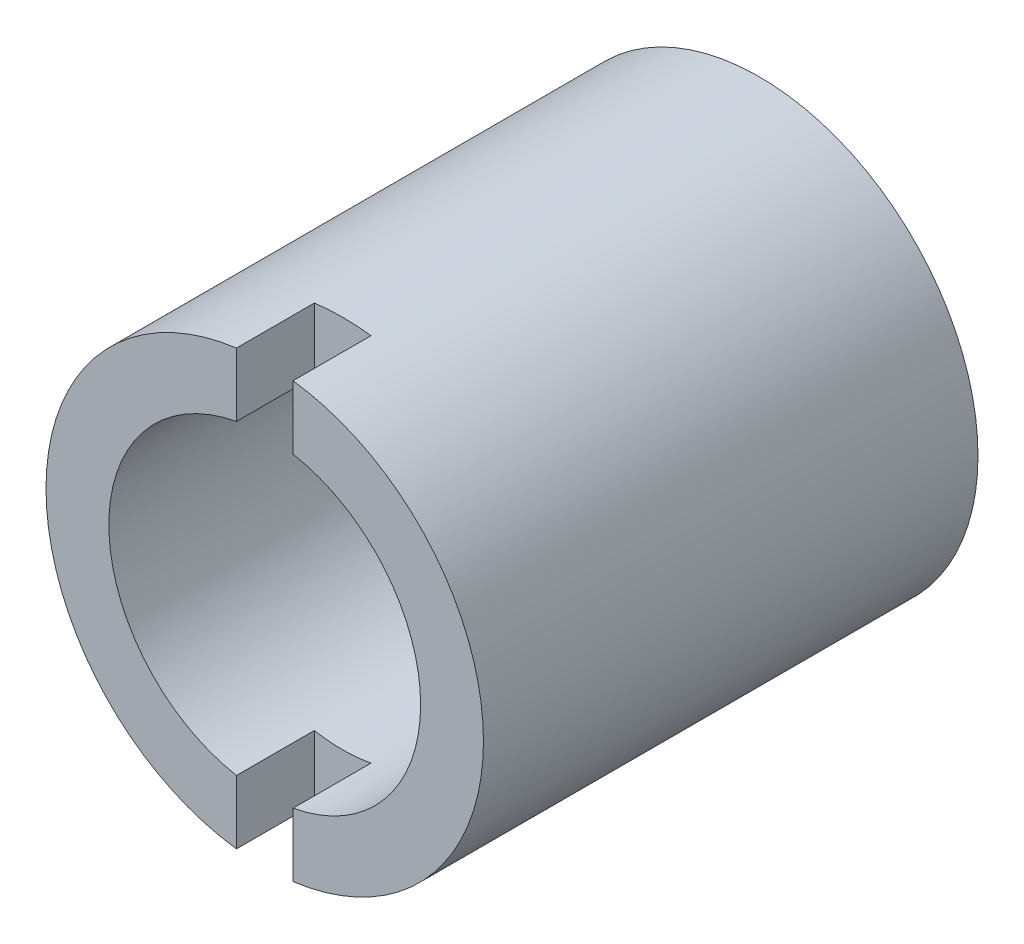
ISO-10303-21;
HEADER;
FILE_DESCRIPTION(('STEP AP214'),'2;1');
FILE_NAME('part.step','',(''),(''),'','','');
FILE_SCHEMA(('AUTOMOTIVE_DESIGN { 1 0 10303 214 1 1 1 1 }'));
ENDSEC;
DATA;
#1=APPLICATION_CONTEXT('core data for automotive mechanical design processes');
#2=APPLICATION_PROTOCOL_DEFINITION('international standard','automotive_design',2000,#1);
#3=PRODUCT_CONTEXT('',#1,'mechanical');
#4=PRODUCT('Part','Part','',(#3));
#5=PRODUCT_RELATED_PRODUCT_CATEGORY('part','',(#4));
#6=PRODUCT_DEFINITION_FORMATION('','',#4);
#7=PRODUCT_DEFINITION_CONTEXT('part definition',#1,'design');
#8=PRODUCT_DEFINITION('design','',#6,#7);
#9=PRODUCT_DEFINITION_SHAPE('','',#8);
#10=(LENGTH_UNIT() NAMED_UNIT(*) SI_UNIT(.MILLI.,.METRE.));
#11=(NAMED_UNIT(*) PLANE_ANGLE_UNIT() SI_UNIT($,.RADIAN.));
#12=(NAMED_UNIT(*) SI_UNIT($,.STERADIAN.) SOLID_ANGLE_UNIT());
#13=UNCERTAINTY_MEASURE_WITH_UNIT(LENGTH_MEASURE(1.E-05),#10,'distance_accuracy_value','');
#14=(GEOMETRIC_REPRESENTATION_CONTEXT(3) GLOBAL_UNCERTAINTY_ASSIGNED_CONTEXT((#13)) GLOBAL_UNIT_ASSIGNED_CONTEXT((#10,
#11,#12)) REPRESENTATION_CONTEXT('',''));
#15=CARTESIAN_POINT('',(0.,0.,0.));
#16=DIRECTION('',(0.,0.,1.));
#17=DIRECTION('',(1.,0.,0.));
#18=AXIS2_PLACEMENT_3D('',#15,#16,#17);
#19=CARTESIAN_POINT('',(0.,0.,0.));
#20=DIRECTION('',(0.,0.,1.));
#21=DIRECTION('',(1.,0.,0.));
#22=AXIS2_PLACEMENT_3D('',#19,#20,#21);
#23=PLANE('',#22);
#24=DIRECTION('',(0.,1.,0.));
#25=VECTOR('',#24,1.);
#26=CARTESIAN_POINT('',(1.18,-10.,0.));
#27=LINE('',#26,#25);
#28=CARTESIAN_POINT('',(1.18,-9.04334009091774,0.));
#29=VERTEX_POINT('',#28);
#30=CARTESIAN_POINT('',(1.18,-6.39199499374022,0.));
#31=VERTEX_POINT('',#30);
#32=EDGE_CURVE('E106',#29,#31,#27,.T.);
#33=ORIENTED_EDGE('',*,*,#32,.F.);
#34=CARTESIAN_POINT('',(0.,0.,0.));
#35=DIRECTION('',(0.,0.,1.));
#36=DIRECTION('',(1.,0.,0.));
#37=AXIS2_PLACEMENT_3D('',#34,#35,#36);
#38=CIRCLE('',#37,9.12);
#39=CARTESIAN_POINT('',(1.18,9.04334009091773,0.));
#40=VERTEX_POINT('',#39);
#41=EDGE_CURVE('E117',#29,#40,#38,.T.);
#42=ORIENTED_EDGE('',*,*,#41,.T.);
#43=CARTESIAN_POINT('',(1.18,6.39199499374022,0.));
#44=VERTEX_POINT('',#43);
#45=EDGE_CURVE('E121',#44,#40,#27,.T.);
#46=ORIENTED_EDGE('',*,*,#45,.F.);
#47=CARTESIAN_POINT('',(0.,0.,0.));
#48=DIRECTION('',(0.,0.,1.));
#49=DIRECTION('',(1.,0.,0.));
#50=AXIS2_PLACEMENT_3D('',#47,#48,#49);
#51=CIRCLE('',#50,6.5);
#52=EDGE_CURVE('E119',#31,#44,#51,.T.);
#53=ORIENTED_EDGE('',*,*,#52,.F.);
#54=EDGE_LOOP('',(#33,#42,#46,#53));
#55=FACE_BOUND('',#54,.T.);
#56=ADVANCED_FACE('F39',(#55),#23,.T.);
#57=CARTESIAN_POINT('',(0.,0.,-20.62));
#58=DIRECTION('',(0.,0.,1.));
#59=DIRECTION('',(1.,0.,0.));
#60=AXIS2_PLACEMENT_3D('',#57,#58,#59);
#61=CYLINDRICAL_SURFACE('',#60,9.12);
#62=DIRECTION('',(0.,0.,1.));
#63=VECTOR('',#62,1.);
#64=CARTESIAN_POINT('',(1.18,-9.04334009091773,-20.62));
#65=LINE('',#64,#63);
#66=CARTESIAN_POINT('',(1.18,-9.04334009091774,-3.25));
#67=VERTEX_POINT('',#66);
#68=EDGE_CURVE('E103',#67,#29,#65,.T.);
#69=ORIENTED_EDGE('',*,*,#68,.F.);
#70=CARTESIAN_POINT('',(0.,0.,-3.25));
#71=DIRECTION('',(0.,0.,-1.));
#72=DIRECTION('',(-1.,0.,0.));
#73=AXIS2_PLACEMENT_3D('',#70,#71,#72);
#74=CIRCLE('',#73,9.12);
#75=CARTESIAN_POINT('',(-1.18,-9.04334009091774,-3.25));
#76=VERTEX_POINT('',#75);
#77=EDGE_CURVE('E168',#76,#67,#74,.F.);
#78=ORIENTED_EDGE('',*,*,#77,.F.);
#79=DIRECTION('',(0.,0.,1.));
#80=VECTOR('',#79,1.);
#81=CARTESIAN_POINT('',(-1.18,-9.04334009091773,-20.62));
#82=LINE('',#81,#80);
#83=CARTESIAN_POINT('',(-1.18,-9.04334009091774,0.));
#84=VERTEX_POINT('',#83);
#85=EDGE_CURVE('E111',#84,#76,#82,.F.);
#86=ORIENTED_EDGE('',*,*,#85,.F.);
#87=CARTESIAN_POINT('',(-1.18,9.04334009091773,0.));
#88=VERTEX_POINT('',#87);
#89=EDGE_CURVE('E126',#88,#84,#38,.T.);
#90=ORIENTED_EDGE('',*,*,#89,.F.);
#91=DIRECTION('',(0.,0.,1.));
#92=VECTOR('',#91,1.);
#93=CARTESIAN_POINT('',(-1.18,9.04334009091773,-20.62));
#94=LINE('',#93,#92);
#95=CARTESIAN_POINT('',(-1.18,9.04334009091774,-3.25));
#96=VERTEX_POINT('',#95);
#97=EDGE_CURVE('E169',#96,#88,#94,.T.);
#98=ORIENTED_EDGE('',*,*,#97,.F.);
#99=CARTESIAN_POINT('',(1.18,9.04334009091774,-3.25));
#100=VERTEX_POINT('',#99);
#101=EDGE_CURVE('E161',#100,#96,#74,.F.);
#102=ORIENTED_EDGE('',*,*,#101,.F.);
#103=DIRECTION('',(0.,0.,1.));
#104=VECTOR('',#103,1.);
#105=CARTESIAN_POINT('',(1.18,9.04334009091773,-20.62));
#106=LINE('',#105,#104);
#107=EDGE_CURVE('E110',#40,#100,#106,.F.);
#108=ORIENTED_EDGE('',*,*,#107,.F.);
#109=ORIENTED_EDGE('',*,*,#41,.F.);
#110=EDGE_LOOP('',(#69,#78,#86,#90,#98,#102,#108,#109));
#111=FACE_BOUND('',#110,.T.);
#112=CARTESIAN_POINT('',(0.,0.,-20.62));
#113=DIRECTION('',(0.,0.,1.));
#114=DIRECTION('',(1.,0.,0.));
#115=AXIS2_PLACEMENT_3D('',#112,#113,#114);
#116=CIRCLE('',#115,9.12);
#117=CARTESIAN_POINT('',(9.12,0.,-20.62));
#118=VERTEX_POINT('',#117);
#119=EDGE_CURVE('E130',#118,#118,#116,.T.);
#120=ORIENTED_EDGE('',*,*,#119,.T.);
#121=EDGE_LOOP('',(#120));
#122=FACE_BOUND('',#121,.T.);
#123=ADVANCED_FACE('F41',(#111,#122),#61,.T.);
#124=CARTESIAN_POINT('',(0.,0.,-20.62));
#125=DIRECTION('',(0.,0.,1.));
#126=DIRECTION('',(1.,0.,0.));
#127=AXIS2_PLACEMENT_3D('',#124,#125,#126);
#128=PLANE('',#127);
#129=CARTESIAN_POINT('',(0.,0.,-20.62));
#130=DIRECTION('',(0.,0.,1.));
#131=DIRECTION('',(1.,0.,0.));
#132=AXIS2_PLACEMENT_3D('',#129,#130,#131);
#133=CIRCLE('',#132,6.5);
#134=CARTESIAN_POINT('',(6.5,0.,-20.62));
#135=VERTEX_POINT('',#134);
#136=EDGE_CURVE('E127',#135,#135,#133,.T.);
#137=ORIENTED_EDGE('',*,*,#136,.T.);
#138=EDGE_LOOP('',(#137));
#139=FACE_BOUND('',#138,.T.);
#140=ORIENTED_EDGE('',*,*,#119,.F.);
#141=EDGE_LOOP('',(#140));
#142=FACE_BOUND('',#141,.T.);
#143=ADVANCED_FACE('F197',(#139,#142),#128,.F.);
#144=DIRECTION('',(0.,-1.,0.));
#145=VECTOR('',#144,1.);
#146=CARTESIAN_POINT('',(-1.18,-10.,0.));
#147=LINE('',#146,#145);
#148=CARTESIAN_POINT('',(-1.18,6.39199499374022,0.));
#149=VERTEX_POINT('',#148);
#150=EDGE_CURVE('E166',#88,#149,#147,.T.);
#151=ORIENTED_EDGE('',*,*,#150,.F.);
#152=ORIENTED_EDGE('',*,*,#89,.T.);
#153=CARTESIAN_POINT('',(-1.18,-6.39199499374022,0.));
#154=VERTEX_POINT('',#153);
#155=EDGE_CURVE('E120',#154,#84,#147,.T.);
#156=ORIENTED_EDGE('',*,*,#155,.F.);
#157=EDGE_CURVE('E132',#149,#154,#51,.T.);
#158=ORIENTED_EDGE('',*,*,#157,.F.);
#159=EDGE_LOOP('',(#151,#152,#156,#158));
#160=FACE_BOUND('',#159,.T.);
#161=ADVANCED_FACE('F175',(#160),#23,.T.);
#162=CARTESIAN_POINT('',(0.,0.,-20.62));
#163=DIRECTION('',(0.,0.,1.));
#164=DIRECTION('',(1.,0.,0.));
#165=AXIS2_PLACEMENT_3D('',#162,#163,#164);
#166=CYLINDRICAL_SURFACE('',#165,6.5);
#167=CARTESIAN_POINT('',(0.,0.,-3.25));
#168=DIRECTION('',(0.,0.,-1.));
#169=DIRECTION('',(-1.,0.,0.));
#170=AXIS2_PLACEMENT_3D('',#167,#168,#169);
#171=CIRCLE('',#170,6.5);
#172=CARTESIAN_POINT('',(-1.18,-6.39199499374022,-3.25));
#173=VERTEX_POINT('',#172);
#174=CARTESIAN_POINT('',(1.18,-6.39199499374022,-3.25));
#175=VERTEX_POINT('',#174);
#176=EDGE_CURVE('E141',#173,#175,#171,.F.);
#177=ORIENTED_EDGE('',*,*,#176,.T.);
#178=DIRECTION('',(0.,0.,1.));
#179=VECTOR('',#178,1.);
#180=CARTESIAN_POINT('',(1.18,-6.39199499374021,-20.62));
#181=LINE('',#180,#179);
#182=EDGE_CURVE('E12',#175,#31,#181,.T.);
#183=ORIENTED_EDGE('',*,*,#182,.T.);
#184=ORIENTED_EDGE('',*,*,#52,.T.);
#185=DIRECTION('',(0.,0.,1.));
#186=VECTOR('',#185,1.);
#187=CARTESIAN_POINT('',(1.18,6.39199499374021,-20.62));
#188=LINE('',#187,#186);
#189=CARTESIAN_POINT('',(1.18,6.39199499374022,-3.25));
#190=VERTEX_POINT('',#189);
#191=EDGE_CURVE('E144',#44,#190,#188,.F.);
#192=ORIENTED_EDGE('',*,*,#191,.T.);
#193=CARTESIAN_POINT('',(-1.18,6.39199499374022,-3.25));
#194=VERTEX_POINT('',#193);
#195=EDGE_CURVE('E137',#190,#194,#171,.F.);
#196=ORIENTED_EDGE('',*,*,#195,.T.);
#197=DIRECTION('',(0.,0.,1.));
#198=VECTOR('',#197,1.);
#199=CARTESIAN_POINT('',(-1.18,6.39199499374021,-20.62));
#200=LINE('',#199,#198);
#201=EDGE_CURVE('E140',#194,#149,#200,.T.);
#202=ORIENTED_EDGE('',*,*,#201,.T.);
#203=ORIENTED_EDGE('',*,*,#157,.T.);
#204=DIRECTION('',(0.,0.,1.));
#205=VECTOR('',#204,1.);
#206=CARTESIAN_POINT('',(-1.18,-6.39199499374021,-20.62));
#207=LINE('',#206,#205);
#208=EDGE_CURVE('E47',#154,#173,#207,.F.);
#209=ORIENTED_EDGE('',*,*,#208,.T.);
#210=EDGE_LOOP('',(#177,#183,#184,#192,#196,#202,#203,#209));
#211=FACE_BOUND('',#210,.T.);
#212=ORIENTED_EDGE('',*,*,#136,.F.);
#213=EDGE_LOOP('',(#212));
#214=FACE_BOUND('',#213,.T.);
#215=ADVANCED_FACE('F150',(#211,#214),#166,.F.);
#216=CARTESIAN_POINT('',(0.,0.,-3.25));
#217=DIRECTION('',(0.,0.,-1.));
#218=DIRECTION('',(-1.,0.,0.));
#219=AXIS2_PLACEMENT_3D('',#216,#217,#218);
#220=PLANE('',#219);
#221=ORIENTED_EDGE('',*,*,#101,.T.);
#222=DIRECTION('',(0.,-1.,0.));
#223=VECTOR('',#222,1.);
#224=CARTESIAN_POINT('',(-1.18,-10.,-3.25));
#225=LINE('',#224,#223);
#226=EDGE_CURVE('E62',#96,#194,#225,.T.);
#227=ORIENTED_EDGE('',*,*,#226,.T.);
#228=ORIENTED_EDGE('',*,*,#195,.F.);
#229=DIRECTION('',(0.,1.,0.));
#230=VECTOR('',#229,1.);
#231=CARTESIAN_POINT('',(1.18,-10.,-3.25));
#232=LINE('',#231,#230);
#233=EDGE_CURVE('E162',#190,#100,#232,.T.);
#234=ORIENTED_EDGE('',*,*,#233,.T.);
#235=EDGE_LOOP('',(#221,#227,#228,#234));
#236=FACE_BOUND('',#235,.T.);
#237=ADVANCED_FACE('F182',(#236),#220,.F.);
#238=CARTESIAN_POINT('',(-1.18,-10.,-3.25));
#239=DIRECTION('',(-1.,0.,0.));
#240=DIRECTION('',(0.,0.,1.));
#241=AXIS2_PLACEMENT_3D('',#238,#239,#240);
#242=PLANE('',#241);
#243=ORIENTED_EDGE('',*,*,#97,.T.);
#244=ORIENTED_EDGE('',*,*,#150,.T.);
#245=ORIENTED_EDGE('',*,*,#201,.F.);
#246=ORIENTED_EDGE('',*,*,#226,.F.);
#247=EDGE_LOOP('',(#243,#244,#245,#246));
#248=FACE_BOUND('',#247,.T.);
#249=ADVANCED_FACE('F179',(#248),#242,.F.);
#250=CARTESIAN_POINT('',(1.18,-10.,-3.25));
#251=DIRECTION('',(1.,0.,0.));
#252=DIRECTION('',(0.,0.,-1.));
#253=AXIS2_PLACEMENT_3D('',#250,#251,#252);
#254=PLANE('',#253);
#255=ORIENTED_EDGE('',*,*,#107,.T.);
#256=ORIENTED_EDGE('',*,*,#233,.F.);
#257=ORIENTED_EDGE('',*,*,#191,.F.);
#258=ORIENTED_EDGE('',*,*,#45,.T.);
#259=EDGE_LOOP('',(#255,#256,#257,#258));
#260=FACE_BOUND('',#259,.T.);
#261=ADVANCED_FACE('F184',(#260),#254,.F.);
#262=ORIENTED_EDGE('',*,*,#68,.T.);
#263=ORIENTED_EDGE('',*,*,#32,.T.);
#264=ORIENTED_EDGE('',*,*,#182,.F.);
#265=EDGE_CURVE('E54',#67,#175,#232,.T.);
#266=ORIENTED_EDGE('',*,*,#265,.F.);
#267=EDGE_LOOP('',(#262,#263,#264,#266));
#268=FACE_BOUND('',#267,.T.);
#269=ADVANCED_FACE('F105',(#268),#254,.F.);
#270=ORIENTED_EDGE('',*,*,#85,.T.);
#271=EDGE_CURVE('E155',#173,#76,#225,.T.);
#272=ORIENTED_EDGE('',*,*,#271,.F.);
#273=ORIENTED_EDGE('',*,*,#208,.F.);
#274=ORIENTED_EDGE('',*,*,#155,.T.);
#275=EDGE_LOOP('',(#270,#272,#273,#274));
#276=FACE_BOUND('',#275,.T.);
#277=ADVANCED_FACE('F157',(#276),#242,.F.);
#278=ORIENTED_EDGE('',*,*,#77,.T.);
#279=ORIENTED_EDGE('',*,*,#265,.T.);
#280=ORIENTED_EDGE('',*,*,#176,.F.);
#281=ORIENTED_EDGE('',*,*,#271,.T.);
#282=EDGE_LOOP('',(#278,#279,#280,#281));
#283=FACE_BOUND('',#282,.T.);
#284=ADVANCED_FACE('F154',(#283),#220,.F.);
#285=CLOSED_SHELL('',(#56,#123,#143,#161,#215,#237,#249,#261,#269,#277,#284));
#286=MANIFOLD_SOLID_BREP('B2',#285);
#287=ADVANCED_BREP_SHAPE_REPRESENTATION('',(#18,#286),#14);
#288=SHAPE_DEFINITION_REPRESENTATION(#9,#287);
ENDSEC;
END-ISO-10303-21;
